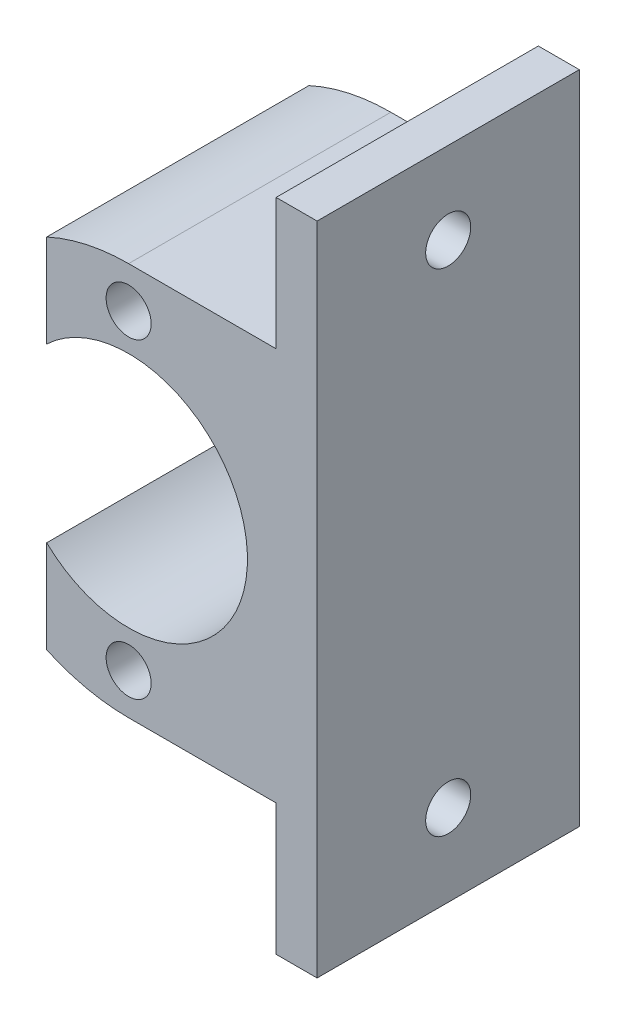
ISO-10303-21;
HEADER;
FILE_DESCRIPTION(('STEP AP214'),'2;1');
FILE_NAME('part.step','',(''),(''),'','','');
FILE_SCHEMA(('AUTOMOTIVE_DESIGN { 1 0 10303 214 1 1 1 1 }'));
ENDSEC;
DATA;
#1=APPLICATION_CONTEXT('core data for automotive mechanical design processes');
#2=APPLICATION_PROTOCOL_DEFINITION('international standard','automotive_design',2000,#1);
#3=PRODUCT_CONTEXT('',#1,'mechanical');
#4=PRODUCT('Part','Part','',(#3));
#5=PRODUCT_RELATED_PRODUCT_CATEGORY('part','',(#4));
#6=PRODUCT_DEFINITION_FORMATION('','',#4);
#7=PRODUCT_DEFINITION_CONTEXT('part definition',#1,'design');
#8=PRODUCT_DEFINITION('design','',#6,#7);
#9=PRODUCT_DEFINITION_SHAPE('','',#8);
#10=(LENGTH_UNIT() NAMED_UNIT(*) SI_UNIT(.MILLI.,.METRE.));
#11=(NAMED_UNIT(*) PLANE_ANGLE_UNIT() SI_UNIT($,.RADIAN.));
#12=(NAMED_UNIT(*) SI_UNIT($,.STERADIAN.) SOLID_ANGLE_UNIT());
#13=UNCERTAINTY_MEASURE_WITH_UNIT(LENGTH_MEASURE(1.E-05),#10,'distance_accuracy_value','');
#14=(GEOMETRIC_REPRESENTATION_CONTEXT(3) GLOBAL_UNCERTAINTY_ASSIGNED_CONTEXT((#13)) GLOBAL_UNIT_ASSIGNED_CONTEXT((#10,
#11,#12)) REPRESENTATION_CONTEXT('',''));
#15=CARTESIAN_POINT('',(0.,0.,0.));
#16=DIRECTION('',(0.,0.,1.));
#17=DIRECTION('',(1.,0.,0.));
#18=AXIS2_PLACEMENT_3D('',#15,#16,#17);
#19=CARTESIAN_POINT('',(17.5127224604637,-28.0217745994644,32.));
#20=DIRECTION('',(0.,1.,0.));
#21=DIRECTION('',(0.,0.,1.));
#22=AXIS2_PLACEMENT_3D('',#19,#20,#21);
#23=PLANE('',#22);
#24=DIRECTION('',(0.,0.,1.));
#25=VECTOR('',#24,1.);
#26=CARTESIAN_POINT('',(12.5127224604637,-28.0217745994644,32.));
#27=LINE('',#26,#25);
#28=CARTESIAN_POINT('',(12.5127224604637,-28.0217745994644,0.));
#29=VERTEX_POINT('',#28);
#30=CARTESIAN_POINT('',(12.5127224604637,-28.0217745994644,32.));
#31=VERTEX_POINT('',#30);
#32=EDGE_CURVE('E141',#29,#31,#27,.T.);
#33=ORIENTED_EDGE('',*,*,#32,.T.);
#34=DIRECTION('',(1.,0.,0.));
#35=VECTOR('',#34,1.);
#36=CARTESIAN_POINT('',(17.5127224604637,-28.0217745994644,32.));
#37=LINE('',#36,#35);
#38=CARTESIAN_POINT('',(-5.48727753953628,-28.0217745994644,32.));
#39=VERTEX_POINT('',#38);
#40=EDGE_CURVE('E157',#39,#31,#37,.T.);
#41=ORIENTED_EDGE('',*,*,#40,.F.);
#42=DIRECTION('',(0.,0.,-1.));
#43=VECTOR('',#42,1.);
#44=CARTESIAN_POINT('',(-5.48727753953628,-28.0217745994644,32.));
#45=LINE('',#44,#43);
#46=CARTESIAN_POINT('',(-5.48727753953628,-28.0217745994644,0.));
#47=VERTEX_POINT('',#46);
#48=EDGE_CURVE('E275',#39,#47,#45,.T.);
#49=ORIENTED_EDGE('',*,*,#48,.T.);
#50=DIRECTION('',(1.,0.,0.));
#51=VECTOR('',#50,1.);
#52=CARTESIAN_POINT('',(17.5127224604637,-28.0217745994644,0.));
#53=LINE('',#52,#51);
#54=EDGE_CURVE('E263',#47,#29,#53,.T.);
#55=ORIENTED_EDGE('',*,*,#54,.T.);
#56=EDGE_LOOP('',(#33,#41,#49,#55));
#57=FACE_BOUND('',#56,.T.);
#58=ADVANCED_FACE('F41',(#57),#23,.F.);
#59=CARTESIAN_POINT('',(-5.48727753953628,-4.02177459946437,32.));
#60=DIRECTION('',(0.,0.,-1.));
#61=DIRECTION('',(-1.,0.,0.));
#62=AXIS2_PLACEMENT_3D('',#59,#60,#61);
#63=PLANE('',#62);
#64=CARTESIAN_POINT('',(-5.48727753953628,-4.02177459946437,32.));
#65=DIRECTION('',(0.,0.,1.));
#66=DIRECTION('',(-1.,0.,0.));
#67=AXIS2_PLACEMENT_3D('',#64,#65,#66);
#68=CIRCLE('',#67,24.);
#69=CARTESIAN_POINT('',(-5.48727753953628,19.9782254005356,32.));
#70=VERTEX_POINT('',#69);
#71=CARTESIAN_POINT('',(-15.4872775395363,17.7956496298071,32.));
#72=VERTEX_POINT('',#71);
#73=EDGE_CURVE('E224',#70,#72,#68,.T.);
#74=ORIENTED_EDGE('',*,*,#73,.T.);
#75=DIRECTION('',(0.,-1.,0.));
#76=VECTOR('',#75,1.);
#77=CARTESIAN_POINT('',(-15.4872775395363,17.7956496298071,32.));
#78=LINE('',#77,#76);
#79=CARTESIAN_POINT('',(-15.4872775395363,6.47822540053563,32.));
#80=VERTEX_POINT('',#79);
#81=EDGE_CURVE('E227',#72,#80,#78,.T.);
#82=ORIENTED_EDGE('',*,*,#81,.T.);
#83=CARTESIAN_POINT('',(-5.48727753953628,-4.02177459946437,32.));
#84=DIRECTION('',(0.,0.,-1.));
#85=DIRECTION('',(-1.,0.,0.));
#86=AXIS2_PLACEMENT_3D('',#83,#84,#85);
#87=CIRCLE('',#86,14.5);
#88=CARTESIAN_POINT('',(-15.4872775395363,-14.5217745994644,32.));
#89=VERTEX_POINT('',#88);
#90=EDGE_CURVE('E231',#80,#89,#87,.T.);
#91=ORIENTED_EDGE('',*,*,#90,.T.);
#92=DIRECTION('',(0.,-1.,0.));
#93=VECTOR('',#92,1.);
#94=CARTESIAN_POINT('',(-15.4872775395363,-14.5217745994644,32.));
#95=LINE('',#94,#93);
#96=CARTESIAN_POINT('',(-15.4872775395363,-25.8391988287358,32.));
#97=VERTEX_POINT('',#96);
#98=EDGE_CURVE('E234',#89,#97,#95,.T.);
#99=ORIENTED_EDGE('',*,*,#98,.T.);
#100=CARTESIAN_POINT('',(-5.48727753953628,-4.02177459946437,32.));
#101=DIRECTION('',(0.,0.,1.));
#102=DIRECTION('',(1.,0.,0.));
#103=AXIS2_PLACEMENT_3D('',#100,#101,#102);
#104=CIRCLE('',#103,24.);
#105=EDGE_CURVE('E237',#97,#39,#104,.T.);
#106=ORIENTED_EDGE('',*,*,#105,.T.);
#107=ORIENTED_EDGE('',*,*,#40,.T.);
#108=DIRECTION('',(0.,-1.,0.));
#109=VECTOR('',#108,1.);
#110=CARTESIAN_POINT('',(12.5127224604637,-28.0217745994644,32.));
#111=LINE('',#110,#109);
#112=CARTESIAN_POINT('',(12.5127224604637,-44.0217745994644,32.));
#113=VERTEX_POINT('',#112);
#114=EDGE_CURVE('E147',#31,#113,#111,.T.);
#115=ORIENTED_EDGE('',*,*,#114,.T.);
#116=DIRECTION('',(1.,0.,0.));
#117=VECTOR('',#116,1.);
#118=CARTESIAN_POINT('',(12.5127224604637,-44.0217745994644,32.));
#119=LINE('',#118,#117);
#120=CARTESIAN_POINT('',(17.5127224604637,-44.0217745994644,32.));
#121=VERTEX_POINT('',#120);
#122=EDGE_CURVE('E130',#113,#121,#119,.T.);
#123=ORIENTED_EDGE('',*,*,#122,.T.);
#124=DIRECTION('',(0.,1.,0.));
#125=VECTOR('',#124,1.);
#126=CARTESIAN_POINT('',(17.5127224604637,19.9782254005356,32.));
#127=LINE('',#126,#125);
#128=CARTESIAN_POINT('',(17.5127224604637,35.9782254005356,32.));
#129=VERTEX_POINT('',#128);
#130=EDGE_CURVE('E242',#121,#129,#127,.T.);
#131=ORIENTED_EDGE('',*,*,#130,.T.);
#132=DIRECTION('',(1.,0.,0.));
#133=VECTOR('',#132,1.);
#134=CARTESIAN_POINT('',(12.5127224604637,35.9782254005356,32.));
#135=LINE('',#134,#133);
#136=CARTESIAN_POINT('',(12.5127224604637,35.9782254005356,32.));
#137=VERTEX_POINT('',#136);
#138=EDGE_CURVE('E200',#137,#129,#135,.T.);
#139=ORIENTED_EDGE('',*,*,#138,.F.);
#140=DIRECTION('',(0.,-1.,0.));
#141=VECTOR('',#140,1.);
#142=CARTESIAN_POINT('',(12.5127224604637,19.9782254005356,32.));
#143=LINE('',#142,#141);
#144=CARTESIAN_POINT('',(12.5127224604637,19.9782254005356,32.));
#145=VERTEX_POINT('',#144);
#146=EDGE_CURVE('E182',#137,#145,#143,.T.);
#147=ORIENTED_EDGE('',*,*,#146,.T.);
#148=DIRECTION('',(-1.,0.,0.));
#149=VECTOR('',#148,1.);
#150=CARTESIAN_POINT('',(-5.48727753953628,19.9782254005356,32.));
#151=LINE('',#150,#149);
#152=EDGE_CURVE('E57',#145,#70,#151,.T.);
#153=ORIENTED_EDGE('',*,*,#152,.T.);
#154=EDGE_LOOP('',(#74,#82,#91,#99,#106,#107,#115,#123,#131,#139,#147,#153));
#155=FACE_BOUND('',#154,.T.);
#156=CARTESIAN_POINT('',(-5.48727753953628,14.9782254005356,32.));
#157=DIRECTION('',(0.,0.,1.));
#158=DIRECTION('',(1.,0.,0.));
#159=AXIS2_PLACEMENT_3D('',#156,#157,#158);
#160=CIRCLE('',#159,2.74999999999999);
#161=CARTESIAN_POINT('',(-2.73727753953629,14.9782254005356,32.));
#162=VERTEX_POINT('',#161);
#163=EDGE_CURVE('E216',#162,#162,#160,.T.);
#164=ORIENTED_EDGE('',*,*,#163,.F.);
#165=EDGE_LOOP('',(#164));
#166=FACE_BOUND('',#165,.T.);
#167=CARTESIAN_POINT('',(-5.48727753953628,-23.0217745994644,32.));
#168=DIRECTION('',(0.,0.,1.));
#169=DIRECTION('',(1.,0.,0.));
#170=AXIS2_PLACEMENT_3D('',#167,#168,#169);
#171=CIRCLE('',#170,2.75);
#172=CARTESIAN_POINT('',(-2.73727753953628,-23.0217745994644,32.));
#173=VERTEX_POINT('',#172);
#174=EDGE_CURVE('E208',#173,#173,#171,.T.);
#175=ORIENTED_EDGE('',*,*,#174,.F.);
#176=EDGE_LOOP('',(#175));
#177=FACE_BOUND('',#176,.T.);
#178=ADVANCED_FACE('F154',(#155,#166,#177),#63,.F.);
#179=CARTESIAN_POINT('',(-5.48727753953628,-4.02177459946437,0.));
#180=DIRECTION('',(0.,0.,-1.));
#181=DIRECTION('',(-1.,0.,0.));
#182=AXIS2_PLACEMENT_3D('',#179,#180,#181);
#183=PLANE('',#182);
#184=CARTESIAN_POINT('',(-5.48727753953628,14.9782254005356,0.));
#185=DIRECTION('',(0.,0.,1.));
#186=DIRECTION('',(1.,0.,0.));
#187=AXIS2_PLACEMENT_3D('',#184,#185,#186);
#188=CIRCLE('',#187,2.74999999999999);
#189=CARTESIAN_POINT('',(-2.73727753953629,14.9782254005356,0.));
#190=VERTEX_POINT('',#189);
#191=EDGE_CURVE('E212',#190,#190,#188,.T.);
#192=ORIENTED_EDGE('',*,*,#191,.T.);
#193=EDGE_LOOP('',(#192));
#194=FACE_BOUND('',#193,.T.);
#195=CARTESIAN_POINT('',(-5.48727753953628,-4.02177459946437,0.));
#196=DIRECTION('',(0.,0.,1.));
#197=DIRECTION('',(-1.,0.,0.));
#198=AXIS2_PLACEMENT_3D('',#195,#196,#197);
#199=CIRCLE('',#198,24.);
#200=CARTESIAN_POINT('',(-5.48727753953628,19.9782254005356,0.));
#201=VERTEX_POINT('',#200);
#202=CARTESIAN_POINT('',(-15.4872775395363,17.7956496298071,0.));
#203=VERTEX_POINT('',#202);
#204=EDGE_CURVE('E220',#201,#203,#199,.T.);
#205=ORIENTED_EDGE('',*,*,#204,.F.);
#206=DIRECTION('',(-1.,0.,0.));
#207=VECTOR('',#206,1.);
#208=CARTESIAN_POINT('',(-5.48727753953628,19.9782254005356,0.));
#209=LINE('',#208,#207);
#210=CARTESIAN_POINT('',(12.5127224604637,19.9782254005356,0.));
#211=VERTEX_POINT('',#210);
#212=EDGE_CURVE('E228',#211,#201,#209,.T.);
#213=ORIENTED_EDGE('',*,*,#212,.F.);
#214=DIRECTION('',(0.,1.,0.));
#215=VECTOR('',#214,1.);
#216=CARTESIAN_POINT('',(12.5127224604637,19.9782254005356,0.));
#217=LINE('',#216,#215);
#218=CARTESIAN_POINT('',(12.5127224604637,35.9782254005356,0.));
#219=VERTEX_POINT('',#218);
#220=EDGE_CURVE('E188',#211,#219,#217,.T.);
#221=ORIENTED_EDGE('',*,*,#220,.T.);
#222=DIRECTION('',(1.,0.,0.));
#223=VECTOR('',#222,1.);
#224=CARTESIAN_POINT('',(12.5127224604637,35.9782254005356,0.));
#225=LINE('',#224,#223);
#226=CARTESIAN_POINT('',(17.5127224604637,35.9782254005356,0.));
#227=VERTEX_POINT('',#226);
#228=EDGE_CURVE('E196',#219,#227,#225,.T.);
#229=ORIENTED_EDGE('',*,*,#228,.T.);
#230=DIRECTION('',(0.,1.,0.));
#231=VECTOR('',#230,1.);
#232=CARTESIAN_POINT('',(17.5127224604637,19.9782254005356,0.));
#233=LINE('',#232,#231);
#234=CARTESIAN_POINT('',(17.5127224604637,-44.0217745994644,0.));
#235=VERTEX_POINT('',#234);
#236=EDGE_CURVE('E267',#235,#227,#233,.T.);
#237=ORIENTED_EDGE('',*,*,#236,.F.);
#238=DIRECTION('',(1.,0.,0.));
#239=VECTOR('',#238,1.);
#240=CARTESIAN_POINT('',(12.5127224604637,-44.0217745994644,0.));
#241=LINE('',#240,#239);
#242=CARTESIAN_POINT('',(12.5127224604637,-44.0217745994644,0.));
#243=VERTEX_POINT('',#242);
#244=EDGE_CURVE('E140',#243,#235,#241,.T.);
#245=ORIENTED_EDGE('',*,*,#244,.F.);
#246=DIRECTION('',(0.,1.,0.));
#247=VECTOR('',#246,1.);
#248=CARTESIAN_POINT('',(12.5127224604637,-28.0217745994644,0.));
#249=LINE('',#248,#247);
#250=EDGE_CURVE('E149',#243,#29,#249,.T.);
#251=ORIENTED_EDGE('',*,*,#250,.T.);
#252=ORIENTED_EDGE('',*,*,#54,.F.);
#253=CARTESIAN_POINT('',(-5.48727753953628,-4.02177459946437,0.));
#254=DIRECTION('',(0.,0.,1.));
#255=DIRECTION('',(1.,0.,0.));
#256=AXIS2_PLACEMENT_3D('',#253,#254,#255);
#257=CIRCLE('',#256,24.);
#258=CARTESIAN_POINT('',(-15.4872775395363,-25.8391988287358,0.));
#259=VERTEX_POINT('',#258);
#260=EDGE_CURVE('E260',#259,#47,#257,.T.);
#261=ORIENTED_EDGE('',*,*,#260,.F.);
#262=DIRECTION('',(0.,-1.,0.));
#263=VECTOR('',#262,1.);
#264=CARTESIAN_POINT('',(-15.4872775395363,-14.5217745994644,0.));
#265=LINE('',#264,#263);
#266=CARTESIAN_POINT('',(-15.4872775395363,-14.5217745994644,0.));
#267=VERTEX_POINT('',#266);
#268=EDGE_CURVE('E257',#267,#259,#265,.T.);
#269=ORIENTED_EDGE('',*,*,#268,.F.);
#270=CARTESIAN_POINT('',(-5.48727753953628,-4.02177459946437,0.));
#271=DIRECTION('',(0.,0.,-1.));
#272=DIRECTION('',(-1.,0.,0.));
#273=AXIS2_PLACEMENT_3D('',#270,#271,#272);
#274=CIRCLE('',#273,14.5);
#275=CARTESIAN_POINT('',(-15.4872775395363,6.47822540053563,0.));
#276=VERTEX_POINT('',#275);
#277=EDGE_CURVE('E254',#276,#267,#274,.T.);
#278=ORIENTED_EDGE('',*,*,#277,.F.);
#279=DIRECTION('',(0.,-1.,0.));
#280=VECTOR('',#279,1.);
#281=CARTESIAN_POINT('',(-15.4872775395363,17.7956496298071,0.));
#282=LINE('',#281,#280);
#283=EDGE_CURVE('E251',#203,#276,#282,.T.);
#284=ORIENTED_EDGE('',*,*,#283,.F.);
#285=EDGE_LOOP('',(#205,#213,#221,#229,#237,#245,#251,#252,#261,#269,#278,#284));
#286=FACE_BOUND('',#285,.T.);
#287=CARTESIAN_POINT('',(-5.48727753953628,-23.0217745994644,0.));
#288=DIRECTION('',(0.,0.,1.));
#289=DIRECTION('',(1.,0.,0.));
#290=AXIS2_PLACEMENT_3D('',#287,#288,#289);
#291=CIRCLE('',#290,2.75);
#292=CARTESIAN_POINT('',(-2.73727753953628,-23.0217745994644,0.));
#293=VERTEX_POINT('',#292);
#294=EDGE_CURVE('E204',#293,#293,#291,.T.);
#295=ORIENTED_EDGE('',*,*,#294,.T.);
#296=EDGE_LOOP('',(#295));
#297=FACE_BOUND('',#296,.T.);
#298=ADVANCED_FACE('F298',(#194,#286,#297),#183,.T.);
#299=CARTESIAN_POINT('',(-5.48727753953628,-4.02177459946437,32.));
#300=DIRECTION('',(0.,0.,-1.));
#301=DIRECTION('',(-1.,0.,0.));
#302=AXIS2_PLACEMENT_3D('',#299,#300,#301);
#303=CYLINDRICAL_SURFACE('',#302,24.);
#304=ORIENTED_EDGE('',*,*,#204,.T.);
#305=DIRECTION('',(0.,0.,-1.));
#306=VECTOR('',#305,1.);
#307=CARTESIAN_POINT('',(-15.4872775395363,17.7956496298071,32.));
#308=LINE('',#307,#306);
#309=EDGE_CURVE('E11',#72,#203,#308,.T.);
#310=ORIENTED_EDGE('',*,*,#309,.F.);
#311=ORIENTED_EDGE('',*,*,#73,.F.);
#312=DIRECTION('',(0.,0.,-1.));
#313=VECTOR('',#312,1.);
#314=CARTESIAN_POINT('',(-5.48727753953628,19.9782254005356,32.));
#315=LINE('',#314,#313);
#316=EDGE_CURVE('E247',#70,#201,#315,.T.);
#317=ORIENTED_EDGE('',*,*,#316,.T.);
#318=EDGE_LOOP('',(#304,#310,#311,#317));
#319=FACE_BOUND('',#318,.T.);
#320=ADVANCED_FACE('F43',(#319),#303,.T.);
#321=CARTESIAN_POINT('',(-15.4872775395363,17.7956496298071,32.));
#322=DIRECTION('',(1.,0.,0.));
#323=DIRECTION('',(0.,0.,-1.));
#324=AXIS2_PLACEMENT_3D('',#321,#322,#323);
#325=PLANE('',#324);
#326=ORIENTED_EDGE('',*,*,#283,.T.);
#327=DIRECTION('',(0.,0.,-1.));
#328=VECTOR('',#327,1.);
#329=CARTESIAN_POINT('',(-15.4872775395363,6.47822540053563,32.));
#330=LINE('',#329,#328);
#331=EDGE_CURVE('E50',#80,#276,#330,.T.);
#332=ORIENTED_EDGE('',*,*,#331,.F.);
#333=ORIENTED_EDGE('',*,*,#81,.F.);
#334=ORIENTED_EDGE('',*,*,#309,.T.);
#335=EDGE_LOOP('',(#326,#332,#333,#334));
#336=FACE_BOUND('',#335,.T.);
#337=ADVANCED_FACE('F312',(#336),#325,.F.);
#338=CARTESIAN_POINT('',(-5.48727753953628,-4.02177459946437,32.));
#339=DIRECTION('',(0.,0.,-1.));
#340=DIRECTION('',(-1.,0.,0.));
#341=AXIS2_PLACEMENT_3D('',#338,#339,#340);
#342=CYLINDRICAL_SURFACE('',#341,14.5);
#343=ORIENTED_EDGE('',*,*,#277,.T.);
#344=DIRECTION('',(0.,0.,-1.));
#345=VECTOR('',#344,1.);
#346=CARTESIAN_POINT('',(-15.4872775395363,-14.5217745994644,32.));
#347=LINE('',#346,#345);
#348=EDGE_CURVE('E283',#89,#267,#347,.T.);
#349=ORIENTED_EDGE('',*,*,#348,.F.);
#350=ORIENTED_EDGE('',*,*,#90,.F.);
#351=ORIENTED_EDGE('',*,*,#331,.T.);
#352=EDGE_LOOP('',(#343,#349,#350,#351));
#353=FACE_BOUND('',#352,.T.);
#354=ADVANCED_FACE('F292',(#353),#342,.F.);
#355=CARTESIAN_POINT('',(-15.4872775395363,-14.5217745994644,32.));
#356=DIRECTION('',(1.,0.,0.));
#357=DIRECTION('',(0.,1.,0.));
#358=AXIS2_PLACEMENT_3D('',#355,#356,#357);
#359=PLANE('',#358);
#360=ORIENTED_EDGE('',*,*,#268,.T.);
#361=DIRECTION('',(0.,0.,-1.));
#362=VECTOR('',#361,1.);
#363=CARTESIAN_POINT('',(-15.4872775395363,-25.8391988287358,32.));
#364=LINE('',#363,#362);
#365=EDGE_CURVE('E279',#97,#259,#364,.T.);
#366=ORIENTED_EDGE('',*,*,#365,.F.);
#367=ORIENTED_EDGE('',*,*,#98,.F.);
#368=ORIENTED_EDGE('',*,*,#348,.T.);
#369=EDGE_LOOP('',(#360,#366,#367,#368));
#370=FACE_BOUND('',#369,.T.);
#371=ADVANCED_FACE('F304',(#370),#359,.F.);
#372=CARTESIAN_POINT('',(-5.48727753953628,-4.02177459946437,32.));
#373=DIRECTION('',(0.,0.,-1.));
#374=DIRECTION('',(-1.,0.,0.));
#375=AXIS2_PLACEMENT_3D('',#372,#373,#374);
#376=CYLINDRICAL_SURFACE('',#375,24.);
#377=ORIENTED_EDGE('',*,*,#260,.T.);
#378=ORIENTED_EDGE('',*,*,#48,.F.);
#379=ORIENTED_EDGE('',*,*,#105,.F.);
#380=ORIENTED_EDGE('',*,*,#365,.T.);
#381=EDGE_LOOP('',(#377,#378,#379,#380));
#382=FACE_BOUND('',#381,.T.);
#383=ADVANCED_FACE('F308',(#382),#376,.T.);
#384=CARTESIAN_POINT('',(17.5127224604637,19.9782254005356,32.));
#385=DIRECTION('',(-1.,0.,0.));
#386=DIRECTION('',(0.,-1.,0.));
#387=AXIS2_PLACEMENT_3D('',#384,#385,#386);
#388=PLANE('',#387);
#389=ORIENTED_EDGE('',*,*,#236,.T.);
#390=DIRECTION('',(0.,0.,1.));
#391=VECTOR('',#390,1.);
#392=CARTESIAN_POINT('',(17.5127224604637,35.9782254005356,32.));
#393=LINE('',#392,#391);
#394=EDGE_CURVE('E178',#227,#129,#393,.T.);
#395=ORIENTED_EDGE('',*,*,#394,.T.);
#396=ORIENTED_EDGE('',*,*,#130,.F.);
#397=DIRECTION('',(0.,0.,-1.));
#398=VECTOR('',#397,1.);
#399=CARTESIAN_POINT('',(17.5127224604637,-44.0217745994644,32.));
#400=LINE('',#399,#398);
#401=EDGE_CURVE('E136',#121,#235,#400,.T.);
#402=ORIENTED_EDGE('',*,*,#401,.T.);
#403=EDGE_LOOP('',(#389,#395,#396,#402));
#404=FACE_BOUND('',#403,.T.);
#405=CARTESIAN_POINT('',(17.5127224604637,25.9782254005356,16.));
#406=DIRECTION('',(1.,0.,0.));
#407=DIRECTION('',(0.,1.,0.));
#408=AXIS2_PLACEMENT_3D('',#405,#406,#407);
#409=CIRCLE('',#408,2.75);
#410=CARTESIAN_POINT('',(17.5127224604637,28.7282254005356,16.));
#411=VERTEX_POINT('',#410);
#412=EDGE_CURVE('E172',#411,#411,#409,.T.);
#413=ORIENTED_EDGE('',*,*,#412,.F.);
#414=EDGE_LOOP('',(#413));
#415=FACE_BOUND('',#414,.T.);
#416=CARTESIAN_POINT('',(17.5127224604637,-34.0217745994644,16.));
#417=DIRECTION('',(1.,0.,0.));
#418=DIRECTION('',(0.,1.,0.));
#419=AXIS2_PLACEMENT_3D('',#416,#417,#418);
#420=CIRCLE('',#419,2.75);
#421=CARTESIAN_POINT('',(17.5127224604637,-31.2717745994644,16.));
#422=VERTEX_POINT('',#421);
#423=EDGE_CURVE('E164',#422,#422,#420,.T.);
#424=ORIENTED_EDGE('',*,*,#423,.F.);
#425=EDGE_LOOP('',(#424));
#426=FACE_BOUND('',#425,.T.);
#427=ADVANCED_FACE('F323',(#404,#415,#426),#388,.F.);
#428=CARTESIAN_POINT('',(-5.48727753953628,19.9782254005356,32.));
#429=DIRECTION('',(0.,-1.,0.));
#430=DIRECTION('',(0.,0.,-1.));
#431=AXIS2_PLACEMENT_3D('',#428,#429,#430);
#432=PLANE('',#431);
#433=ORIENTED_EDGE('',*,*,#152,.F.);
#434=DIRECTION('',(0.,0.,-1.));
#435=VECTOR('',#434,1.);
#436=CARTESIAN_POINT('',(12.5127224604637,19.9782254005356,32.));
#437=LINE('',#436,#435);
#438=EDGE_CURVE('E61',#145,#211,#437,.T.);
#439=ORIENTED_EDGE('',*,*,#438,.T.);
#440=ORIENTED_EDGE('',*,*,#212,.T.);
#441=ORIENTED_EDGE('',*,*,#316,.F.);
#442=EDGE_LOOP('',(#433,#439,#440,#441));
#443=FACE_BOUND('',#442,.T.);
#444=ADVANCED_FACE('F325',(#443),#432,.F.);
#445=CARTESIAN_POINT('',(-5.48727753953628,14.9782254005356,32.));
#446=DIRECTION('',(0.,0.,-1.));
#447=DIRECTION('',(-1.,0.,0.));
#448=AXIS2_PLACEMENT_3D('',#445,#446,#447);
#449=CYLINDRICAL_SURFACE('',#448,2.74999999999999);
#450=ORIENTED_EDGE('',*,*,#163,.T.);
#451=EDGE_LOOP('',(#450));
#452=FACE_BOUND('',#451,.T.);
#453=ORIENTED_EDGE('',*,*,#191,.F.);
#454=EDGE_LOOP('',(#453));
#455=FACE_BOUND('',#454,.T.);
#456=ADVANCED_FACE('F327',(#452,#455),#449,.F.);
#457=CARTESIAN_POINT('',(-5.48727753953628,-23.0217745994644,32.));
#458=DIRECTION('',(0.,0.,-1.));
#459=DIRECTION('',(-1.,0.,0.));
#460=AXIS2_PLACEMENT_3D('',#457,#458,#459);
#461=CYLINDRICAL_SURFACE('',#460,2.75);
#462=ORIENTED_EDGE('',*,*,#174,.T.);
#463=EDGE_LOOP('',(#462));
#464=FACE_BOUND('',#463,.T.);
#465=ORIENTED_EDGE('',*,*,#294,.F.);
#466=EDGE_LOOP('',(#465));
#467=FACE_BOUND('',#466,.T.);
#468=ADVANCED_FACE('F333',(#464,#467),#461,.F.);
#469=CARTESIAN_POINT('',(12.5127224604637,35.9782254005356,32.));
#470=DIRECTION('',(0.,1.,0.));
#471=DIRECTION('',(-1.,0.,0.));
#472=AXIS2_PLACEMENT_3D('',#469,#470,#471);
#473=PLANE('',#472);
#474=ORIENTED_EDGE('',*,*,#394,.F.);
#475=ORIENTED_EDGE('',*,*,#228,.F.);
#476=DIRECTION('',(0.,0.,1.));
#477=VECTOR('',#476,1.);
#478=CARTESIAN_POINT('',(12.5127224604637,35.9782254005356,32.));
#479=LINE('',#478,#477);
#480=EDGE_CURVE('E192',#219,#137,#479,.T.);
#481=ORIENTED_EDGE('',*,*,#480,.T.);
#482=ORIENTED_EDGE('',*,*,#138,.T.);
#483=EDGE_LOOP('',(#474,#475,#481,#482));
#484=FACE_BOUND('',#483,.T.);
#485=ADVANCED_FACE('F321',(#484),#473,.T.);
#486=CARTESIAN_POINT('',(12.5127224604637,0.,0.));
#487=DIRECTION('',(-1.,0.,0.));
#488=DIRECTION('',(0.,0.,1.));
#489=AXIS2_PLACEMENT_3D('',#486,#487,#488);
#490=PLANE('',#489);
#491=CARTESIAN_POINT('',(12.5127224604637,25.9782254005356,16.));
#492=DIRECTION('',(1.,0.,0.));
#493=DIRECTION('',(0.,1.,0.));
#494=AXIS2_PLACEMENT_3D('',#491,#492,#493);
#495=CIRCLE('',#494,2.75);
#496=CARTESIAN_POINT('',(12.5127224604637,28.7282254005356,16.));
#497=VERTEX_POINT('',#496);
#498=EDGE_CURVE('E174',#497,#497,#495,.T.);
#499=ORIENTED_EDGE('',*,*,#498,.T.);
#500=EDGE_LOOP('',(#499));
#501=FACE_BOUND('',#500,.T.);
#502=ORIENTED_EDGE('',*,*,#146,.F.);
#503=ORIENTED_EDGE('',*,*,#480,.F.);
#504=ORIENTED_EDGE('',*,*,#220,.F.);
#505=ORIENTED_EDGE('',*,*,#438,.F.);
#506=EDGE_LOOP('',(#502,#503,#504,#505));
#507=FACE_BOUND('',#506,.T.);
#508=ADVANCED_FACE('F318',(#501,#507),#490,.T.);
#509=CARTESIAN_POINT('',(12.5127224604637,25.9782254005356,16.));
#510=DIRECTION('',(1.,0.,0.));
#511=DIRECTION('',(0.,1.,0.));
#512=AXIS2_PLACEMENT_3D('',#509,#510,#511);
#513=CYLINDRICAL_SURFACE('',#512,2.75);
#514=ORIENTED_EDGE('',*,*,#498,.F.);
#515=EDGE_LOOP('',(#514));
#516=FACE_BOUND('',#515,.T.);
#517=ORIENTED_EDGE('',*,*,#412,.T.);
#518=EDGE_LOOP('',(#517));
#519=FACE_BOUND('',#518,.T.);
#520=ADVANCED_FACE('F369',(#516,#519),#513,.F.);
#521=CARTESIAN_POINT('',(12.5127224604637,-44.0217745994644,32.));
#522=DIRECTION('',(0.,-1.,0.));
#523=DIRECTION('',(1.,0.,0.));
#524=AXIS2_PLACEMENT_3D('',#521,#522,#523);
#525=PLANE('',#524);
#526=ORIENTED_EDGE('',*,*,#401,.F.);
#527=ORIENTED_EDGE('',*,*,#122,.F.);
#528=DIRECTION('',(0.,0.,-1.));
#529=VECTOR('',#528,1.);
#530=CARTESIAN_POINT('',(12.5127224604637,-44.0217745994644,32.));
#531=LINE('',#530,#529);
#532=EDGE_CURVE('E134',#113,#243,#531,.T.);
#533=ORIENTED_EDGE('',*,*,#532,.T.);
#534=ORIENTED_EDGE('',*,*,#244,.T.);
#535=EDGE_LOOP('',(#526,#527,#533,#534));
#536=FACE_BOUND('',#535,.T.);
#537=ADVANCED_FACE('F132',(#536),#525,.T.);
#538=CARTESIAN_POINT('',(12.5127224604637,0.,0.));
#539=DIRECTION('',(1.,0.,0.));
#540=DIRECTION('',(0.,1.,0.));
#541=AXIS2_PLACEMENT_3D('',#538,#539,#540);
#542=PLANE('',#541);
#543=CARTESIAN_POINT('',(12.5127224604637,-34.0217745994644,16.));
#544=DIRECTION('',(1.,0.,0.));
#545=DIRECTION('',(0.,1.,0.));
#546=AXIS2_PLACEMENT_3D('',#543,#544,#545);
#547=CIRCLE('',#546,2.75);
#548=CARTESIAN_POINT('',(12.5127224604637,-31.2717745994644,16.));
#549=VERTEX_POINT('',#548);
#550=EDGE_CURVE('E161',#549,#549,#547,.T.);
#551=ORIENTED_EDGE('',*,*,#550,.T.);
#552=EDGE_LOOP('',(#551));
#553=FACE_BOUND('',#552,.T.);
#554=ORIENTED_EDGE('',*,*,#114,.F.);
#555=ORIENTED_EDGE('',*,*,#32,.F.);
#556=ORIENTED_EDGE('',*,*,#250,.F.);
#557=ORIENTED_EDGE('',*,*,#532,.F.);
#558=EDGE_LOOP('',(#554,#555,#556,#557));
#559=FACE_BOUND('',#558,.T.);
#560=ADVANCED_FACE('F145',(#553,#559),#542,.F.);
#561=CARTESIAN_POINT('',(12.5127224604637,-34.0217745994644,16.));
#562=DIRECTION('',(1.,0.,0.));
#563=DIRECTION('',(0.,1.,0.));
#564=AXIS2_PLACEMENT_3D('',#561,#562,#563);
#565=CYLINDRICAL_SURFACE('',#564,2.75);
#566=ORIENTED_EDGE('',*,*,#550,.F.);
#567=EDGE_LOOP('',(#566));
#568=FACE_BOUND('',#567,.T.);
#569=ORIENTED_EDGE('',*,*,#423,.T.);
#570=EDGE_LOOP('',(#569));
#571=FACE_BOUND('',#570,.T.);
#572=ADVANCED_FACE('F378',(#568,#571),#565,.F.);
#573=CLOSED_SHELL('',(#58,#178,#298,#320,#337,#354,#371,#383,#427,#444,#456,#468,#485,#508,#520,
#537,#560,#572));
#574=MANIFOLD_SOLID_BREP('B2',#573);
#575=ADVANCED_BREP_SHAPE_REPRESENTATION('',(#18,#574),#14);
#576=SHAPE_DEFINITION_REPRESENTATION(#9,#575);
ENDSEC;
END-ISO-10303-21;
